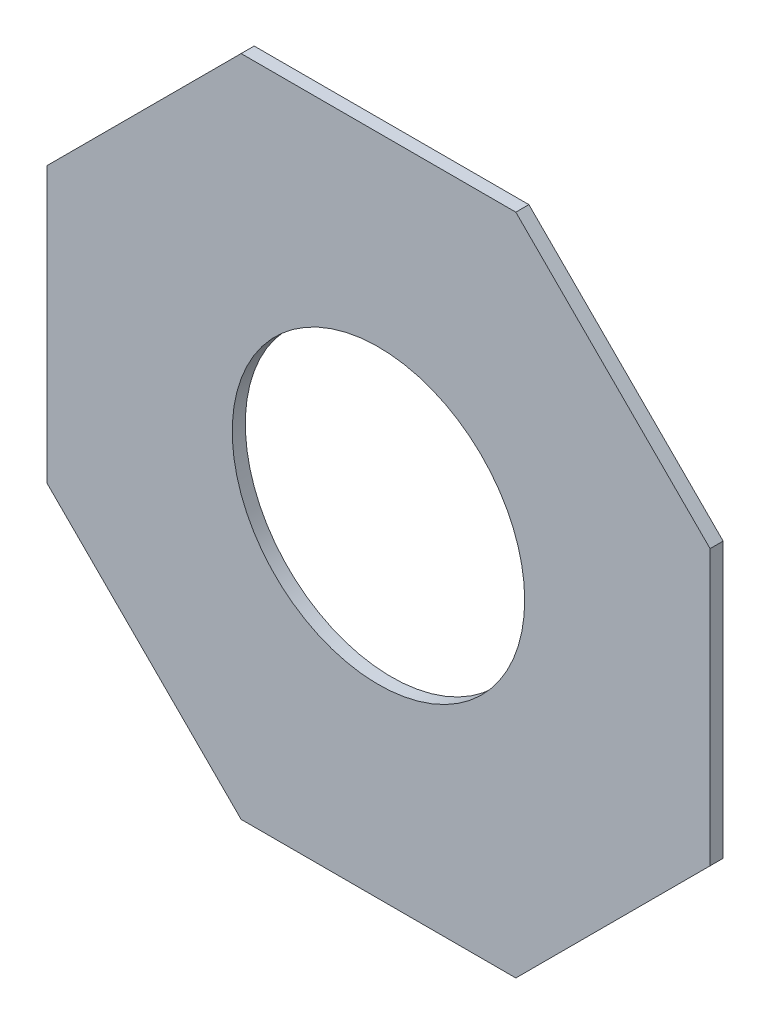
ISO-10303-21;
HEADER;
FILE_DESCRIPTION(('STEP AP214'),'2;1');
FILE_NAME('part.step','',(''),(''),'','','');
FILE_SCHEMA(('AUTOMOTIVE_DESIGN { 1 0 10303 214 1 1 1 1 }'));
ENDSEC;
DATA;
#1=APPLICATION_CONTEXT('core data for automotive mechanical design processes');
#2=APPLICATION_PROTOCOL_DEFINITION('international standard','automotive_design',2000,#1);
#3=PRODUCT_CONTEXT('',#1,'mechanical');
#4=PRODUCT('Part','Part','',(#3));
#5=PRODUCT_RELATED_PRODUCT_CATEGORY('part','',(#4));
#6=PRODUCT_DEFINITION_FORMATION('','',#4);
#7=PRODUCT_DEFINITION_CONTEXT('part definition',#1,'design');
#8=PRODUCT_DEFINITION('design','',#6,#7);
#9=PRODUCT_DEFINITION_SHAPE('','',#8);
#10=(LENGTH_UNIT() NAMED_UNIT(*) SI_UNIT(.MILLI.,.METRE.));
#11=(NAMED_UNIT(*) PLANE_ANGLE_UNIT() SI_UNIT($,.RADIAN.));
#12=(NAMED_UNIT(*) SI_UNIT($,.STERADIAN.) SOLID_ANGLE_UNIT());
#13=UNCERTAINTY_MEASURE_WITH_UNIT(LENGTH_MEASURE(1.E-05),#10,'distance_accuracy_value','');
#14=(GEOMETRIC_REPRESENTATION_CONTEXT(3) GLOBAL_UNCERTAINTY_ASSIGNED_CONTEXT((#13)) GLOBAL_UNIT_ASSIGNED_CONTEXT((#10,
#11,#12)) REPRESENTATION_CONTEXT('',''));
#15=CARTESIAN_POINT('',(0.,0.,0.));
#16=DIRECTION('',(0.,0.,1.));
#17=DIRECTION('',(1.,0.,0.));
#18=AXIS2_PLACEMENT_3D('',#15,#16,#17);
#19=CARTESIAN_POINT('',(0.,0.,0.05));
#20=DIRECTION('',(0.,0.,1.));
#21=DIRECTION('',(1.,0.,0.));
#22=AXIS2_PLACEMENT_3D('',#19,#20,#21);
#23=PLANE('',#22);
#24=DIRECTION('',(0.,1.,0.));
#25=VECTOR('',#24,1.);
#26=CARTESIAN_POINT('',(1.27,-0.52605122421383,0.05));
#27=LINE('',#26,#25);
#28=CARTESIAN_POINT('',(1.27,-0.52605122421383,0.05));
#29=VERTEX_POINT('',#28);
#30=CARTESIAN_POINT('',(1.27,0.526051224213831,0.05));
#31=VERTEX_POINT('',#30);
#32=EDGE_CURVE('E145',#29,#31,#27,.T.);
#33=ORIENTED_EDGE('',*,*,#32,.T.);
#34=DIRECTION('',(-0.707106781186548,0.707106781186547,0.));
#35=VECTOR('',#34,1.);
#36=CARTESIAN_POINT('',(1.27,0.526051224213831,0.05));
#37=LINE('',#36,#35);
#38=CARTESIAN_POINT('',(0.526051224213831,1.27,0.05));
#39=VERTEX_POINT('',#38);
#40=EDGE_CURVE('E93',#31,#39,#37,.T.);
#41=ORIENTED_EDGE('',*,*,#40,.T.);
#42=DIRECTION('',(-1.,0.,0.));
#43=VECTOR('',#42,1.);
#44=CARTESIAN_POINT('',(0.526051224213831,1.27,0.05));
#45=LINE('',#44,#43);
#46=CARTESIAN_POINT('',(-0.526051224213831,1.27,0.05));
#47=VERTEX_POINT('',#46);
#48=EDGE_CURVE('E160',#39,#47,#45,.T.);
#49=ORIENTED_EDGE('',*,*,#48,.T.);
#50=DIRECTION('',(-0.707106781186547,-0.707106781186548,0.));
#51=VECTOR('',#50,1.);
#52=CARTESIAN_POINT('',(-0.526051224213831,1.27,0.05));
#53=LINE('',#52,#51);
#54=CARTESIAN_POINT('',(-1.27,0.52605122421383,0.05));
#55=VERTEX_POINT('',#54);
#56=EDGE_CURVE('E173',#47,#55,#53,.T.);
#57=ORIENTED_EDGE('',*,*,#56,.T.);
#58=DIRECTION('',(0.,-1.,0.));
#59=VECTOR('',#58,1.);
#60=CARTESIAN_POINT('',(-1.27,0.52605122421383,0.05));
#61=LINE('',#60,#59);
#62=CARTESIAN_POINT('',(-1.27,-0.526051224213831,0.05));
#63=VERTEX_POINT('',#62);
#64=EDGE_CURVE('E112',#55,#63,#61,.T.);
#65=ORIENTED_EDGE('',*,*,#64,.T.);
#66=DIRECTION('',(0.707106781186548,-0.707106781186547,0.));
#67=VECTOR('',#66,1.);
#68=CARTESIAN_POINT('',(-1.27,-0.526051224213831,0.05));
#69=LINE('',#68,#67);
#70=CARTESIAN_POINT('',(-0.52605122421383,-1.27,0.05));
#71=VERTEX_POINT('',#70);
#72=EDGE_CURVE('E106',#63,#71,#69,.T.);
#73=ORIENTED_EDGE('',*,*,#72,.T.);
#74=DIRECTION('',(1.,0.,0.));
#75=VECTOR('',#74,1.);
#76=CARTESIAN_POINT('',(-0.52605122421383,-1.27,0.05));
#77=LINE('',#76,#75);
#78=CARTESIAN_POINT('',(0.526051224213831,-1.27,0.05));
#79=VERTEX_POINT('',#78);
#80=EDGE_CURVE('E110',#71,#79,#77,.T.);
#81=ORIENTED_EDGE('',*,*,#80,.T.);
#82=DIRECTION('',(0.707106781186547,0.707106781186548,0.));
#83=VECTOR('',#82,1.);
#84=CARTESIAN_POINT('',(0.526051224213831,-1.27,0.05));
#85=LINE('',#84,#83);
#86=EDGE_CURVE('E50',#79,#29,#85,.T.);
#87=ORIENTED_EDGE('',*,*,#86,.T.);
#88=EDGE_LOOP('',(#33,#41,#49,#57,#65,#73,#81,#87));
#89=FACE_BOUND('',#88,.T.);
#90=CARTESIAN_POINT('',(0.,0.,0.05));
#91=DIRECTION('',(0.,0.,1.));
#92=DIRECTION('',(1.,0.,0.));
#93=AXIS2_PLACEMENT_3D('',#90,#91,#92);
#94=CIRCLE('',#93,0.56);
#95=CARTESIAN_POINT('',(0.56,0.,0.05));
#96=VERTEX_POINT('',#95);
#97=EDGE_CURVE('E134',#96,#96,#94,.T.);
#98=ORIENTED_EDGE('',*,*,#97,.F.);
#99=EDGE_LOOP('',(#98));
#100=FACE_BOUND('',#99,.T.);
#101=ADVANCED_FACE('F33',(#89,#100),#23,.T.);
#102=CARTESIAN_POINT('',(0.,0.,0.));
#103=DIRECTION('',(0.,0.,1.));
#104=DIRECTION('',(1.,0.,0.));
#105=AXIS2_PLACEMENT_3D('',#102,#103,#104);
#106=PLANE('',#105);
#107=DIRECTION('',(0.,1.,0.));
#108=VECTOR('',#107,1.);
#109=CARTESIAN_POINT('',(1.27,-0.52605122421383,0.));
#110=LINE('',#109,#108);
#111=CARTESIAN_POINT('',(1.27,-0.52605122421383,0.));
#112=VERTEX_POINT('',#111);
#113=CARTESIAN_POINT('',(1.27,0.526051224213831,0.));
#114=VERTEX_POINT('',#113);
#115=EDGE_CURVE('E130',#112,#114,#110,.T.);
#116=ORIENTED_EDGE('',*,*,#115,.F.);
#117=DIRECTION('',(0.707106781186547,0.707106781186548,0.));
#118=VECTOR('',#117,1.);
#119=CARTESIAN_POINT('',(0.526051224213831,-1.27,0.));
#120=LINE('',#119,#118);
#121=CARTESIAN_POINT('',(0.526051224213831,-1.27,0.));
#122=VERTEX_POINT('',#121);
#123=EDGE_CURVE('E85',#122,#112,#120,.T.);
#124=ORIENTED_EDGE('',*,*,#123,.F.);
#125=DIRECTION('',(1.,0.,0.));
#126=VECTOR('',#125,1.);
#127=CARTESIAN_POINT('',(-0.52605122421383,-1.27,0.));
#128=LINE('',#127,#126);
#129=CARTESIAN_POINT('',(-0.52605122421383,-1.27,0.));
#130=VERTEX_POINT('',#129);
#131=EDGE_CURVE('E79',#130,#122,#128,.T.);
#132=ORIENTED_EDGE('',*,*,#131,.F.);
#133=DIRECTION('',(0.707106781186548,-0.707106781186547,0.));
#134=VECTOR('',#133,1.);
#135=CARTESIAN_POINT('',(-1.27,-0.526051224213831,0.));
#136=LINE('',#135,#134);
#137=CARTESIAN_POINT('',(-1.27,-0.526051224213831,0.));
#138=VERTEX_POINT('',#137);
#139=EDGE_CURVE('E120',#138,#130,#136,.T.);
#140=ORIENTED_EDGE('',*,*,#139,.F.);
#141=DIRECTION('',(0.,-1.,0.));
#142=VECTOR('',#141,1.);
#143=CARTESIAN_POINT('',(-1.27,0.52605122421383,0.));
#144=LINE('',#143,#142);
#145=CARTESIAN_POINT('',(-1.27,0.52605122421383,0.));
#146=VERTEX_POINT('',#145);
#147=EDGE_CURVE('E140',#146,#138,#144,.T.);
#148=ORIENTED_EDGE('',*,*,#147,.F.);
#149=DIRECTION('',(-0.707106781186547,-0.707106781186548,0.));
#150=VECTOR('',#149,1.);
#151=CARTESIAN_POINT('',(-0.526051224213831,1.27,0.));
#152=LINE('',#151,#150);
#153=CARTESIAN_POINT('',(-0.526051224213831,1.27,0.));
#154=VERTEX_POINT('',#153);
#155=EDGE_CURVE('E138',#154,#146,#152,.T.);
#156=ORIENTED_EDGE('',*,*,#155,.F.);
#157=DIRECTION('',(-1.,0.,0.));
#158=VECTOR('',#157,1.);
#159=CARTESIAN_POINT('',(0.526051224213831,1.27,0.));
#160=LINE('',#159,#158);
#161=CARTESIAN_POINT('',(0.526051224213831,1.27,0.));
#162=VERTEX_POINT('',#161);
#163=EDGE_CURVE('E136',#162,#154,#160,.T.);
#164=ORIENTED_EDGE('',*,*,#163,.F.);
#165=DIRECTION('',(-0.707106781186548,0.707106781186547,0.));
#166=VECTOR('',#165,1.);
#167=CARTESIAN_POINT('',(1.27,0.526051224213831,0.));
#168=LINE('',#167,#166);
#169=EDGE_CURVE('E133',#114,#162,#168,.T.);
#170=ORIENTED_EDGE('',*,*,#169,.F.);
#171=EDGE_LOOP('',(#116,#124,#132,#140,#148,#156,#164,#170));
#172=FACE_BOUND('',#171,.T.);
#173=CARTESIAN_POINT('',(0.,0.,0.));
#174=DIRECTION('',(0.,0.,1.));
#175=DIRECTION('',(1.,0.,0.));
#176=AXIS2_PLACEMENT_3D('',#173,#174,#175);
#177=CIRCLE('',#176,0.56);
#178=CARTESIAN_POINT('',(0.56,0.,0.));
#179=VERTEX_POINT('',#178);
#180=EDGE_CURVE('E179',#179,#179,#177,.T.);
#181=ORIENTED_EDGE('',*,*,#180,.T.);
#182=EDGE_LOOP('',(#181));
#183=FACE_BOUND('',#182,.T.);
#184=ADVANCED_FACE('F164',(#172,#183),#106,.F.);
#185=CARTESIAN_POINT('',(1.27,-0.52605122421383,0.05));
#186=DIRECTION('',(-1.,0.,0.));
#187=DIRECTION('',(0.,-1.,0.));
#188=AXIS2_PLACEMENT_3D('',#185,#186,#187);
#189=PLANE('',#188);
#190=ORIENTED_EDGE('',*,*,#115,.T.);
#191=DIRECTION('',(0.,0.,-1.));
#192=VECTOR('',#191,1.);
#193=CARTESIAN_POINT('',(1.27,0.526051224213831,0.05));
#194=LINE('',#193,#192);
#195=EDGE_CURVE('E11',#31,#114,#194,.T.);
#196=ORIENTED_EDGE('',*,*,#195,.F.);
#197=ORIENTED_EDGE('',*,*,#32,.F.);
#198=DIRECTION('',(0.,0.,-1.));
#199=VECTOR('',#198,1.);
#200=CARTESIAN_POINT('',(1.27,-0.52605122421383,0.05));
#201=LINE('',#200,#199);
#202=EDGE_CURVE('E126',#29,#112,#201,.T.);
#203=ORIENTED_EDGE('',*,*,#202,.T.);
#204=EDGE_LOOP('',(#190,#196,#197,#203));
#205=FACE_BOUND('',#204,.T.);
#206=ADVANCED_FACE('F35',(#205),#189,.F.);
#207=CARTESIAN_POINT('',(1.27,0.526051224213831,0.05));
#208=DIRECTION('',(-0.707106781186547,-0.707106781186548,0.));
#209=DIRECTION('',(0.707106781186548,-0.707106781186547,0.));
#210=AXIS2_PLACEMENT_3D('',#207,#208,#209);
#211=PLANE('',#210);
#212=ORIENTED_EDGE('',*,*,#169,.T.);
#213=DIRECTION('',(0.,0.,-1.));
#214=VECTOR('',#213,1.);
#215=CARTESIAN_POINT('',(0.526051224213831,1.27,0.05));
#216=LINE('',#215,#214);
#217=EDGE_CURVE('E42',#39,#162,#216,.T.);
#218=ORIENTED_EDGE('',*,*,#217,.F.);
#219=ORIENTED_EDGE('',*,*,#40,.F.);
#220=ORIENTED_EDGE('',*,*,#195,.T.);
#221=EDGE_LOOP('',(#212,#218,#219,#220));
#222=FACE_BOUND('',#221,.T.);
#223=ADVANCED_FACE('F207',(#222),#211,.F.);
#224=CARTESIAN_POINT('',(0.526051224213831,1.27,0.05));
#225=DIRECTION('',(0.,-1.,0.));
#226=DIRECTION('',(0.,0.,-1.));
#227=AXIS2_PLACEMENT_3D('',#224,#225,#226);
#228=PLANE('',#227);
#229=ORIENTED_EDGE('',*,*,#163,.T.);
#230=DIRECTION('',(0.,0.,-1.));
#231=VECTOR('',#230,1.);
#232=CARTESIAN_POINT('',(-0.526051224213831,1.27,0.05));
#233=LINE('',#232,#231);
#234=EDGE_CURVE('E152',#47,#154,#233,.T.);
#235=ORIENTED_EDGE('',*,*,#234,.F.);
#236=ORIENTED_EDGE('',*,*,#48,.F.);
#237=ORIENTED_EDGE('',*,*,#217,.T.);
#238=EDGE_LOOP('',(#229,#235,#236,#237));
#239=FACE_BOUND('',#238,.T.);
#240=ADVANCED_FACE('F158',(#239),#228,.F.);
#241=CARTESIAN_POINT('',(-0.526051224213831,1.27,0.05));
#242=DIRECTION('',(0.707106781186548,-0.707106781186547,0.));
#243=DIRECTION('',(0.707106781186547,0.707106781186548,0.));
#244=AXIS2_PLACEMENT_3D('',#241,#242,#243);
#245=PLANE('',#244);
#246=ORIENTED_EDGE('',*,*,#155,.T.);
#247=DIRECTION('',(0.,0.,-1.));
#248=VECTOR('',#247,1.);
#249=CARTESIAN_POINT('',(-1.27,0.52605122421383,0.05));
#250=LINE('',#249,#248);
#251=EDGE_CURVE('E149',#55,#146,#250,.T.);
#252=ORIENTED_EDGE('',*,*,#251,.F.);
#253=ORIENTED_EDGE('',*,*,#56,.F.);
#254=ORIENTED_EDGE('',*,*,#234,.T.);
#255=EDGE_LOOP('',(#246,#252,#253,#254));
#256=FACE_BOUND('',#255,.T.);
#257=ADVANCED_FACE('F169',(#256),#245,.F.);
#258=CARTESIAN_POINT('',(-1.27,0.52605122421383,0.05));
#259=DIRECTION('',(1.,0.,0.));
#260=DIRECTION('',(0.,0.,-1.));
#261=AXIS2_PLACEMENT_3D('',#258,#259,#260);
#262=PLANE('',#261);
#263=ORIENTED_EDGE('',*,*,#147,.T.);
#264=DIRECTION('',(0.,0.,-1.));
#265=VECTOR('',#264,1.);
#266=CARTESIAN_POINT('',(-1.27,-0.526051224213831,0.05));
#267=LINE('',#266,#265);
#268=EDGE_CURVE('E121',#63,#138,#267,.T.);
#269=ORIENTED_EDGE('',*,*,#268,.F.);
#270=ORIENTED_EDGE('',*,*,#64,.F.);
#271=ORIENTED_EDGE('',*,*,#251,.T.);
#272=EDGE_LOOP('',(#263,#269,#270,#271));
#273=FACE_BOUND('',#272,.T.);
#274=ADVANCED_FACE('F172',(#273),#262,.F.);
#275=CARTESIAN_POINT('',(-1.27,-0.526051224213831,0.05));
#276=DIRECTION('',(0.707106781186547,0.707106781186548,0.));
#277=DIRECTION('',(-0.707106781186548,0.707106781186547,0.));
#278=AXIS2_PLACEMENT_3D('',#275,#276,#277);
#279=PLANE('',#278);
#280=ORIENTED_EDGE('',*,*,#139,.T.);
#281=DIRECTION('',(0.,0.,-1.));
#282=VECTOR('',#281,1.);
#283=CARTESIAN_POINT('',(-0.52605122421383,-1.27,0.05));
#284=LINE('',#283,#282);
#285=EDGE_CURVE('E117',#71,#130,#284,.T.);
#286=ORIENTED_EDGE('',*,*,#285,.F.);
#287=ORIENTED_EDGE('',*,*,#72,.F.);
#288=ORIENTED_EDGE('',*,*,#268,.T.);
#289=EDGE_LOOP('',(#280,#286,#287,#288));
#290=FACE_BOUND('',#289,.T.);
#291=ADVANCED_FACE('F118',(#290),#279,.F.);
#292=CARTESIAN_POINT('',(-0.52605122421383,-1.27,0.05));
#293=DIRECTION('',(0.,1.,0.));
#294=DIRECTION('',(0.,0.,1.));
#295=AXIS2_PLACEMENT_3D('',#292,#293,#294);
#296=PLANE('',#295);
#297=ORIENTED_EDGE('',*,*,#131,.T.);
#298=DIRECTION('',(0.,0.,-1.));
#299=VECTOR('',#298,1.);
#300=CARTESIAN_POINT('',(0.526051224213831,-1.27,0.05));
#301=LINE('',#300,#299);
#302=EDGE_CURVE('E122',#79,#122,#301,.T.);
#303=ORIENTED_EDGE('',*,*,#302,.F.);
#304=ORIENTED_EDGE('',*,*,#80,.F.);
#305=ORIENTED_EDGE('',*,*,#285,.T.);
#306=EDGE_LOOP('',(#297,#303,#304,#305));
#307=FACE_BOUND('',#306,.T.);
#308=ADVANCED_FACE('F124',(#307),#296,.F.);
#309=CARTESIAN_POINT('',(0.526051224213831,-1.27,0.05));
#310=DIRECTION('',(-0.707106781186548,0.707106781186547,0.));
#311=DIRECTION('',(-0.707106781186547,-0.707106781186548,0.));
#312=AXIS2_PLACEMENT_3D('',#309,#310,#311);
#313=PLANE('',#312);
#314=ORIENTED_EDGE('',*,*,#123,.T.);
#315=ORIENTED_EDGE('',*,*,#202,.F.);
#316=ORIENTED_EDGE('',*,*,#86,.F.);
#317=ORIENTED_EDGE('',*,*,#302,.T.);
#318=EDGE_LOOP('',(#314,#315,#316,#317));
#319=FACE_BOUND('',#318,.T.);
#320=ADVANCED_FACE('F195',(#319),#313,.F.);
#321=CARTESIAN_POINT('',(0.,0.,0.05));
#322=DIRECTION('',(0.,0.,-1.));
#323=DIRECTION('',(-1.,0.,0.));
#324=AXIS2_PLACEMENT_3D('',#321,#322,#323);
#325=CYLINDRICAL_SURFACE('',#324,0.56);
#326=ORIENTED_EDGE('',*,*,#97,.T.);
#327=EDGE_LOOP('',(#326));
#328=FACE_BOUND('',#327,.T.);
#329=ORIENTED_EDGE('',*,*,#180,.F.);
#330=EDGE_LOOP('',(#329));
#331=FACE_BOUND('',#330,.T.);
#332=ADVANCED_FACE('F185',(#328,#331),#325,.F.);
#333=CLOSED_SHELL('',(#101,#184,#206,#223,#240,#257,#274,#291,#308,#320,#332));
#334=MANIFOLD_SOLID_BREP('B2',#333);
#335=ADVANCED_BREP_SHAPE_REPRESENTATION('',(#18,#334),#14);
#336=SHAPE_DEFINITION_REPRESENTATION(#9,#335);
ENDSEC;
END-ISO-10303-21;
